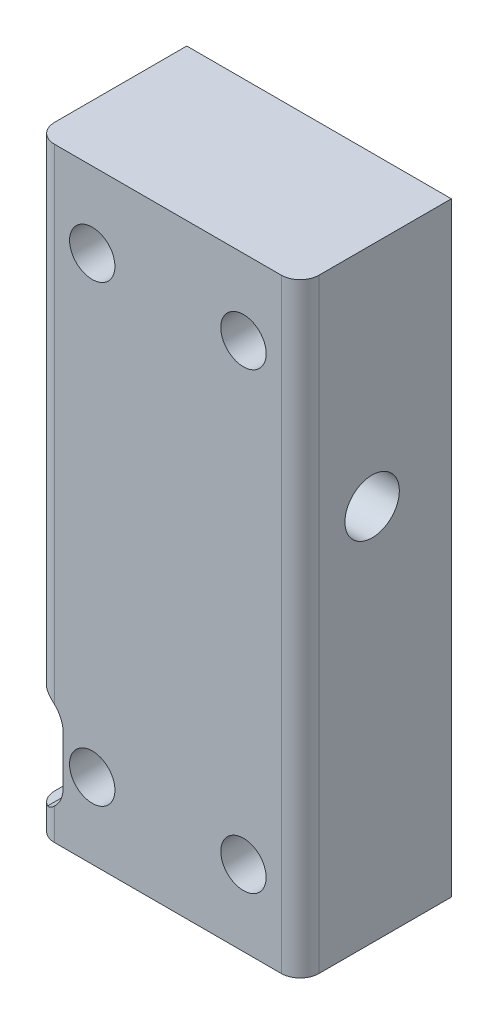
ISO-10303-21;
HEADER;
FILE_DESCRIPTION(('STEP AP214'),'2;1');
FILE_NAME('part.step','',(''),(''),'','','');
FILE_SCHEMA(('AUTOMOTIVE_DESIGN { 1 0 10303 214 1 1 1 1 }'));
ENDSEC;
DATA;
#1=APPLICATION_CONTEXT('core data for automotive mechanical design processes');
#2=APPLICATION_PROTOCOL_DEFINITION('international standard','automotive_design',2000,#1);
#3=PRODUCT_CONTEXT('',#1,'mechanical');
#4=PRODUCT('Part','Part','',(#3));
#5=PRODUCT_RELATED_PRODUCT_CATEGORY('part','',(#4));
#6=PRODUCT_DEFINITION_FORMATION('','',#4);
#7=PRODUCT_DEFINITION_CONTEXT('part definition',#1,'design');
#8=PRODUCT_DEFINITION('design','',#6,#7);
#9=PRODUCT_DEFINITION_SHAPE('','',#8);
#10=(LENGTH_UNIT() NAMED_UNIT(*) SI_UNIT(.MILLI.,.METRE.));
#11=(NAMED_UNIT(*) PLANE_ANGLE_UNIT() SI_UNIT($,.RADIAN.));
#12=(NAMED_UNIT(*) SI_UNIT($,.STERADIAN.) SOLID_ANGLE_UNIT());
#13=UNCERTAINTY_MEASURE_WITH_UNIT(LENGTH_MEASURE(1.E-05),#10,'distance_accuracy_value','');
#14=(GEOMETRIC_REPRESENTATION_CONTEXT(3) GLOBAL_UNCERTAINTY_ASSIGNED_CONTEXT((#13)) GLOBAL_UNIT_ASSIGNED_CONTEXT((#10,
#11,#12)) REPRESENTATION_CONTEXT('',''));
#15=CARTESIAN_POINT('',(0.,0.,0.));
#16=DIRECTION('',(0.,0.,1.));
#17=DIRECTION('',(1.,0.,0.));
#18=AXIS2_PLACEMENT_3D('',#15,#16,#17);
#19=CARTESIAN_POINT('',(0.,50.8,0.));
#20=DIRECTION('',(1.,0.,0.));
#21=DIRECTION('',(0.,0.,-1.));
#22=AXIS2_PLACEMENT_3D('',#19,#20,#21);
#23=PLANE('',#22);
#24=CARTESIAN_POINT('',(0.,31.7500000001631,-6.04519999270203));
#25=DIRECTION('',(1.,0.,0.));
#26=DIRECTION('',(0.,0.,-1.));
#27=AXIS2_PLACEMENT_3D('',#24,#25,#26);
#28=CIRCLE('',#27,2.286);
#29=CARTESIAN_POINT('',(0.,31.7500000001631,-8.33119999270203));
#30=VERTEX_POINT('',#29);
#31=EDGE_CURVE('E156',#30,#30,#28,.T.);
#32=ORIENTED_EDGE('',*,*,#31,.T.);
#33=EDGE_LOOP('',(#32));
#34=FACE_BOUND('',#33,.T.);
#35=DIRECTION('',(0.,0.,1.));
#36=VECTOR('',#35,1.);
#37=CARTESIAN_POINT('',(0.,0.,0.));
#38=LINE('',#37,#36);
#39=CARTESIAN_POINT('',(0.,0.,-12.7));
#40=VERTEX_POINT('',#39);
#41=CARTESIAN_POINT('',(0.,0.,-1.5875));
#42=VERTEX_POINT('',#41);
#43=EDGE_CURVE('E194',#40,#42,#38,.T.);
#44=ORIENTED_EDGE('',*,*,#43,.T.);
#45=DIRECTION('',(0.,-1.,0.));
#46=VECTOR('',#45,1.);
#47=CARTESIAN_POINT('',(0.,50.8,-1.5875));
#48=LINE('',#47,#46);
#49=CARTESIAN_POINT('',(0.,2.15899999999999,-1.5875));
#50=VERTEX_POINT('',#49);
#51=EDGE_CURVE('E235',#42,#50,#48,.F.);
#52=ORIENTED_EDGE('',*,*,#51,.T.);
#53=DIRECTION('',(0.,0.,-1.));
#54=VECTOR('',#53,1.);
#55=CARTESIAN_POINT('',(0.,2.15899999999999,0.));
#56=LINE('',#55,#54);
#57=CARTESIAN_POINT('',(0.,2.159,-6.35));
#58=VERTEX_POINT('',#57);
#59=EDGE_CURVE('E164',#50,#58,#56,.T.);
#60=ORIENTED_EDGE('',*,*,#59,.T.);
#61=CARTESIAN_POINT('',(0.,6.35,-6.35));
#62=DIRECTION('',(1.,0.,0.));
#63=DIRECTION('',(0.,1.,0.));
#64=AXIS2_PLACEMENT_3D('',#61,#62,#63);
#65=CIRCLE('',#64,4.191);
#66=CARTESIAN_POINT('',(0.,10.541,-6.35));
#67=VERTEX_POINT('',#66);
#68=EDGE_CURVE('E338',#58,#67,#65,.T.);
#69=ORIENTED_EDGE('',*,*,#68,.T.);
#70=DIRECTION('',(0.,0.,-1.));
#71=VECTOR('',#70,1.);
#72=CARTESIAN_POINT('',(0.,10.541,0.));
#73=LINE('',#72,#71);
#74=CARTESIAN_POINT('',(0.,10.541,-1.5875));
#75=VERTEX_POINT('',#74);
#76=EDGE_CURVE('E178',#75,#67,#73,.T.);
#77=ORIENTED_EDGE('',*,*,#76,.F.);
#78=DIRECTION('',(0.,-1.,0.));
#79=VECTOR('',#78,1.);
#80=CARTESIAN_POINT('',(0.,50.8,-1.5875));
#81=LINE('',#80,#79);
#82=CARTESIAN_POINT('',(0.,50.8,-1.5875));
#83=VERTEX_POINT('',#82);
#84=EDGE_CURVE('E233',#75,#83,#81,.F.);
#85=ORIENTED_EDGE('',*,*,#84,.T.);
#86=DIRECTION('',(0.,0.,1.));
#87=VECTOR('',#86,1.);
#88=CARTESIAN_POINT('',(0.,50.8,0.));
#89=LINE('',#88,#87);
#90=CARTESIAN_POINT('',(0.,50.8,-12.7));
#91=VERTEX_POINT('',#90);
#92=EDGE_CURVE('E197',#91,#83,#89,.T.);
#93=ORIENTED_EDGE('',*,*,#92,.F.);
#94=DIRECTION('',(0.,-1.,0.));
#95=VECTOR('',#94,1.);
#96=CARTESIAN_POINT('',(0.,50.8,-12.7));
#97=LINE('',#96,#95);
#98=EDGE_CURVE('E207',#91,#40,#97,.T.);
#99=ORIENTED_EDGE('',*,*,#98,.T.);
#100=EDGE_LOOP('',(#44,#52,#60,#69,#77,#85,#93,#99));
#101=FACE_BOUND('',#100,.T.);
#102=ADVANCED_FACE('F38',(#34,#101),#23,.F.);
#103=CARTESIAN_POINT('',(0.,50.8,0.));
#104=DIRECTION('',(0.,0.,-1.));
#105=DIRECTION('',(-1.,0.,0.));
#106=AXIS2_PLACEMENT_3D('',#103,#104,#105);
#107=PLANE('',#106);
#108=CARTESIAN_POINT('',(0.,4.33359649122807,0.));
#109=DIRECTION('',(0.,0.,-1.));
#110=DIRECTION('',(1.,0.,0.));
#111=AXIS2_PLACEMENT_3D('',#108,#109,#110);
#112=CIRCLE('',#111,2.31493174028122);
#113=CARTESIAN_POINT('',(2.286,3.96874999999999,0.));
#114=VERTEX_POINT('',#113);
#115=CARTESIAN_POINT('',(1.5875,2.64873664181583,0.));
#116=VERTEX_POINT('',#115);
#117=EDGE_CURVE('E160',#114,#116,#112,.T.);
#118=ORIENTED_EDGE('',*,*,#117,.T.);
#119=DIRECTION('',(0.,-1.,0.));
#120=VECTOR('',#119,1.);
#121=CARTESIAN_POINT('',(1.5875,50.8,0.));
#122=LINE('',#121,#120);
#123=CARTESIAN_POINT('',(1.5875,0.,0.));
#124=VERTEX_POINT('',#123);
#125=EDGE_CURVE('E226',#116,#124,#122,.T.);
#126=ORIENTED_EDGE('',*,*,#125,.T.);
#127=DIRECTION('',(1.,0.,0.));
#128=VECTOR('',#127,1.);
#129=CARTESIAN_POINT('',(0.,0.,0.));
#130=LINE('',#129,#128);
#131=CARTESIAN_POINT('',(20.6375,0.,0.));
#132=VERTEX_POINT('',#131);
#133=EDGE_CURVE('E210',#124,#132,#130,.T.);
#134=ORIENTED_EDGE('',*,*,#133,.T.);
#135=DIRECTION('',(0.,-1.,0.));
#136=VECTOR('',#135,1.);
#137=CARTESIAN_POINT('',(20.6375,50.8,0.));
#138=LINE('',#137,#136);
#139=CARTESIAN_POINT('',(20.6375,50.8,0.));
#140=VERTEX_POINT('',#139);
#141=EDGE_CURVE('E221',#132,#140,#138,.F.);
#142=ORIENTED_EDGE('',*,*,#141,.T.);
#143=DIRECTION('',(1.,0.,0.));
#144=VECTOR('',#143,1.);
#145=CARTESIAN_POINT('',(0.,50.8,0.));
#146=LINE('',#145,#144);
#147=CARTESIAN_POINT('',(1.5875,50.8,0.));
#148=VERTEX_POINT('',#147);
#149=EDGE_CURVE('E200',#148,#140,#146,.T.);
#150=ORIENTED_EDGE('',*,*,#149,.F.);
#151=DIRECTION('',(0.,-1.,0.));
#152=VECTOR('',#151,1.);
#153=CARTESIAN_POINT('',(1.5875,50.8,0.));
#154=LINE('',#153,#152);
#155=CARTESIAN_POINT('',(1.5875,10.0512633581842,0.));
#156=VERTEX_POINT('',#155);
#157=EDGE_CURVE('E223',#148,#156,#154,.T.);
#158=ORIENTED_EDGE('',*,*,#157,.T.);
#159=CARTESIAN_POINT('',(0.,8.36640350877193,0.));
#160=DIRECTION('',(0.,0.,-1.));
#161=DIRECTION('',(1.,0.,0.));
#162=AXIS2_PLACEMENT_3D('',#159,#160,#161);
#163=CIRCLE('',#162,2.31493174028122);
#164=CARTESIAN_POINT('',(2.286,8.73125,0.));
#165=VERTEX_POINT('',#164);
#166=EDGE_CURVE('E331',#156,#165,#163,.T.);
#167=ORIENTED_EDGE('',*,*,#166,.T.);
#168=DIRECTION('',(0.,-1.,0.));
#169=VECTOR('',#168,1.);
#170=CARTESIAN_POINT('',(2.286,8.73125,0.));
#171=LINE('',#170,#169);
#172=EDGE_CURVE('E329',#165,#114,#171,.T.);
#173=ORIENTED_EDGE('',*,*,#172,.T.);
#174=EDGE_LOOP('',(#118,#126,#134,#142,#150,#158,#167,#173));
#175=FACE_BOUND('',#174,.T.);
#176=CARTESIAN_POINT('',(17.4625,6.35,0.));
#177=DIRECTION('',(0.,0.,-1.));
#178=DIRECTION('',(-1.,0.,0.));
#179=AXIS2_PLACEMENT_3D('',#176,#177,#178);
#180=CIRCLE('',#179,1.905);
#181=CARTESIAN_POINT('',(15.5575,6.35,0.));
#182=VERTEX_POINT('',#181);
#183=EDGE_CURVE('E183',#182,#182,#180,.T.);
#184=ORIENTED_EDGE('',*,*,#183,.T.);
#185=EDGE_LOOP('',(#184));
#186=FACE_BOUND('',#185,.T.);
#187=CARTESIAN_POINT('',(4.7625,44.45,0.));
#188=DIRECTION('',(0.,0.,-1.));
#189=DIRECTION('',(-1.,0.,0.));
#190=AXIS2_PLACEMENT_3D('',#187,#188,#189);
#191=CIRCLE('',#190,1.905);
#192=CARTESIAN_POINT('',(2.8575,44.45,0.));
#193=VERTEX_POINT('',#192);
#194=EDGE_CURVE('E174',#193,#193,#191,.T.);
#195=ORIENTED_EDGE('',*,*,#194,.T.);
#196=EDGE_LOOP('',(#195));
#197=FACE_BOUND('',#196,.T.);
#198=CARTESIAN_POINT('',(4.7625,6.35,0.));
#199=DIRECTION('',(0.,0.,-1.));
#200=DIRECTION('',(-1.,0.,0.));
#201=AXIS2_PLACEMENT_3D('',#198,#199,#200);
#202=CIRCLE('',#201,1.905);
#203=CARTESIAN_POINT('',(2.8575,6.35,0.));
#204=VERTEX_POINT('',#203);
#205=EDGE_CURVE('E175',#204,#204,#202,.T.);
#206=ORIENTED_EDGE('',*,*,#205,.T.);
#207=EDGE_LOOP('',(#206));
#208=FACE_BOUND('',#207,.T.);
#209=CARTESIAN_POINT('',(17.4625,44.45,0.));
#210=DIRECTION('',(0.,0.,-1.));
#211=DIRECTION('',(-1.,0.,0.));
#212=AXIS2_PLACEMENT_3D('',#209,#210,#211);
#213=CIRCLE('',#212,1.905);
#214=CARTESIAN_POINT('',(15.5575,44.45,0.));
#215=VERTEX_POINT('',#214);
#216=EDGE_CURVE('E191',#215,#215,#213,.T.);
#217=ORIENTED_EDGE('',*,*,#216,.T.);
#218=EDGE_LOOP('',(#217));
#219=FACE_BOUND('',#218,.T.);
#220=ADVANCED_FACE('F302',(#175,#186,#197,#208,#219),#107,.F.);
#221=CARTESIAN_POINT('',(22.225,50.8,0.));
#222=DIRECTION('',(-1.,0.,0.));
#223=DIRECTION('',(0.,0.,1.));
#224=AXIS2_PLACEMENT_3D('',#221,#222,#223);
#225=PLANE('',#224);
#226=CARTESIAN_POINT('',(22.225,31.7500000001631,-6.04519999270203));
#227=DIRECTION('',(1.,0.,0.));
#228=DIRECTION('',(0.,0.,-1.));
#229=AXIS2_PLACEMENT_3D('',#226,#227,#228);
#230=CIRCLE('',#229,2.286);
#231=CARTESIAN_POINT('',(22.225,31.7500000001631,-8.33119999270203));
#232=VERTEX_POINT('',#231);
#233=EDGE_CURVE('E506',#232,#232,#230,.T.);
#234=ORIENTED_EDGE('',*,*,#233,.F.);
#235=EDGE_LOOP('',(#234));
#236=FACE_BOUND('',#235,.T.);
#237=DIRECTION('',(0.,0.,-1.));
#238=VECTOR('',#237,1.);
#239=CARTESIAN_POINT('',(22.225,50.8,0.));
#240=LINE('',#239,#238);
#241=CARTESIAN_POINT('',(22.225,50.8,-1.5875));
#242=VERTEX_POINT('',#241);
#243=CARTESIAN_POINT('',(22.225,50.8,-12.7));
#244=VERTEX_POINT('',#243);
#245=EDGE_CURVE('E203',#242,#244,#240,.T.);
#246=ORIENTED_EDGE('',*,*,#245,.F.);
#247=DIRECTION('',(0.,-1.,0.));
#248=VECTOR('',#247,1.);
#249=CARTESIAN_POINT('',(22.225,50.8,-1.5875));
#250=LINE('',#249,#248);
#251=CARTESIAN_POINT('',(22.225,0.,-1.5875));
#252=VERTEX_POINT('',#251);
#253=EDGE_CURVE('E11',#242,#252,#250,.T.);
#254=ORIENTED_EDGE('',*,*,#253,.T.);
#255=DIRECTION('',(0.,0.,-1.));
#256=VECTOR('',#255,1.);
#257=CARTESIAN_POINT('',(22.225,0.,0.));
#258=LINE('',#257,#256);
#259=CARTESIAN_POINT('',(22.225,0.,-12.7));
#260=VERTEX_POINT('',#259);
#261=EDGE_CURVE('E213',#252,#260,#258,.T.);
#262=ORIENTED_EDGE('',*,*,#261,.T.);
#263=DIRECTION('',(0.,-1.,0.));
#264=VECTOR('',#263,1.);
#265=CARTESIAN_POINT('',(22.225,50.8,-12.7));
#266=LINE('',#265,#264);
#267=EDGE_CURVE('E218',#244,#260,#266,.T.);
#268=ORIENTED_EDGE('',*,*,#267,.F.);
#269=EDGE_LOOP('',(#246,#254,#262,#268));
#270=FACE_BOUND('',#269,.T.);
#271=ADVANCED_FACE('F298',(#236,#270),#225,.F.);
#272=CARTESIAN_POINT('',(0.,50.8,-12.7));
#273=DIRECTION('',(0.,0.,1.));
#274=DIRECTION('',(1.,0.,0.));
#275=AXIS2_PLACEMENT_3D('',#272,#273,#274);
#276=PLANE('',#275);
#277=CARTESIAN_POINT('',(17.4625,6.35,-12.7));
#278=DIRECTION('',(0.,0.,-1.));
#279=DIRECTION('',(-1.,0.,0.));
#280=AXIS2_PLACEMENT_3D('',#277,#278,#279);
#281=CIRCLE('',#280,1.905);
#282=CARTESIAN_POINT('',(15.5575,6.35,-12.7));
#283=VERTEX_POINT('',#282);
#284=EDGE_CURVE('E179',#283,#283,#281,.T.);
#285=ORIENTED_EDGE('',*,*,#284,.F.);
#286=EDGE_LOOP('',(#285));
#287=FACE_BOUND('',#286,.T.);
#288=CARTESIAN_POINT('',(4.7625,44.45,-12.7));
#289=DIRECTION('',(0.,0.,-1.));
#290=DIRECTION('',(-1.,0.,0.));
#291=AXIS2_PLACEMENT_3D('',#288,#289,#290);
#292=CIRCLE('',#291,1.905);
#293=CARTESIAN_POINT('',(2.8575,44.45,-12.7));
#294=VERTEX_POINT('',#293);
#295=EDGE_CURVE('E186',#294,#294,#292,.T.);
#296=ORIENTED_EDGE('',*,*,#295,.F.);
#297=EDGE_LOOP('',(#296));
#298=FACE_BOUND('',#297,.T.);
#299=CARTESIAN_POINT('',(4.7625,6.35,-12.7));
#300=DIRECTION('',(0.,0.,-1.));
#301=DIRECTION('',(-1.,0.,0.));
#302=AXIS2_PLACEMENT_3D('',#299,#300,#301);
#303=CIRCLE('',#302,1.905);
#304=CARTESIAN_POINT('',(2.8575,6.35,-12.7));
#305=VERTEX_POINT('',#304);
#306=EDGE_CURVE('E171',#305,#305,#303,.T.);
#307=ORIENTED_EDGE('',*,*,#306,.F.);
#308=EDGE_LOOP('',(#307));
#309=FACE_BOUND('',#308,.T.);
#310=CARTESIAN_POINT('',(17.4625,44.45,-12.7));
#311=DIRECTION('',(0.,0.,-1.));
#312=DIRECTION('',(-1.,0.,0.));
#313=AXIS2_PLACEMENT_3D('',#310,#311,#312);
#314=CIRCLE('',#313,1.905);
#315=CARTESIAN_POINT('',(15.5575,44.45,-12.7));
#316=VERTEX_POINT('',#315);
#317=EDGE_CURVE('E182',#316,#316,#314,.T.);
#318=ORIENTED_EDGE('',*,*,#317,.F.);
#319=EDGE_LOOP('',(#318));
#320=FACE_BOUND('',#319,.T.);
#321=DIRECTION('',(-1.,0.,0.));
#322=VECTOR('',#321,1.);
#323=CARTESIAN_POINT('',(0.,0.,-12.7));
#324=LINE('',#323,#322);
#325=EDGE_CURVE('E201',#260,#40,#324,.T.);
#326=ORIENTED_EDGE('',*,*,#325,.T.);
#327=ORIENTED_EDGE('',*,*,#98,.F.);
#328=DIRECTION('',(-1.,0.,0.));
#329=VECTOR('',#328,1.);
#330=CARTESIAN_POINT('',(0.,50.8,-12.7));
#331=LINE('',#330,#329);
#332=EDGE_CURVE('E205',#244,#91,#331,.T.);
#333=ORIENTED_EDGE('',*,*,#332,.F.);
#334=ORIENTED_EDGE('',*,*,#267,.T.);
#335=EDGE_LOOP('',(#326,#327,#333,#334));
#336=FACE_BOUND('',#335,.T.);
#337=ADVANCED_FACE('F292',(#287,#298,#309,#320,#336),#276,.F.);
#338=CARTESIAN_POINT('',(0.,50.8,0.));
#339=DIRECTION('',(0.,-1.,0.));
#340=DIRECTION('',(0.,0.,-1.));
#341=AXIS2_PLACEMENT_3D('',#338,#339,#340);
#342=PLANE('',#341);
#343=ORIENTED_EDGE('',*,*,#92,.T.);
#344=CARTESIAN_POINT('',(1.5875,50.8,-1.5875));
#345=DIRECTION('',(0.,-1.,0.));
#346=DIRECTION('',(0.,0.,-1.));
#347=AXIS2_PLACEMENT_3D('',#344,#345,#346);
#348=CIRCLE('',#347,1.5875);
#349=EDGE_CURVE('E46',#83,#148,#348,.F.);
#350=ORIENTED_EDGE('',*,*,#349,.T.);
#351=ORIENTED_EDGE('',*,*,#149,.T.);
#352=CARTESIAN_POINT('',(20.6375,50.8,-1.5875));
#353=DIRECTION('',(0.,-1.,0.));
#354=DIRECTION('',(0.,0.,-1.));
#355=AXIS2_PLACEMENT_3D('',#352,#353,#354);
#356=CIRCLE('',#355,1.5875);
#357=EDGE_CURVE('E53',#140,#242,#356,.F.);
#358=ORIENTED_EDGE('',*,*,#357,.T.);
#359=ORIENTED_EDGE('',*,*,#245,.T.);
#360=ORIENTED_EDGE('',*,*,#332,.T.);
#361=EDGE_LOOP('',(#343,#350,#351,#358,#359,#360));
#362=FACE_BOUND('',#361,.T.);
#363=ADVANCED_FACE('F289',(#362),#342,.F.);
#364=CARTESIAN_POINT('',(0.,0.,0.));
#365=DIRECTION('',(0.,-1.,0.));
#366=DIRECTION('',(0.,0.,-1.));
#367=AXIS2_PLACEMENT_3D('',#364,#365,#366);
#368=PLANE('',#367);
#369=ORIENTED_EDGE('',*,*,#133,.F.);
#370=CARTESIAN_POINT('',(1.5875,0.,-1.5875));
#371=DIRECTION('',(0.,-1.,0.));
#372=DIRECTION('',(0.,0.,-1.));
#373=AXIS2_PLACEMENT_3D('',#370,#371,#372);
#374=CIRCLE('',#373,1.5875);
#375=EDGE_CURVE('E231',#124,#42,#374,.T.);
#376=ORIENTED_EDGE('',*,*,#375,.T.);
#377=ORIENTED_EDGE('',*,*,#43,.F.);
#378=ORIENTED_EDGE('',*,*,#325,.F.);
#379=ORIENTED_EDGE('',*,*,#261,.F.);
#380=CARTESIAN_POINT('',(20.6375,0.,-1.5875));
#381=DIRECTION('',(0.,-1.,0.));
#382=DIRECTION('',(0.,0.,-1.));
#383=AXIS2_PLACEMENT_3D('',#380,#381,#382);
#384=CIRCLE('',#383,1.5875);
#385=EDGE_CURVE('E229',#252,#132,#384,.T.);
#386=ORIENTED_EDGE('',*,*,#385,.T.);
#387=EDGE_LOOP('',(#369,#376,#377,#378,#379,#386));
#388=FACE_BOUND('',#387,.T.);
#389=ADVANCED_FACE('F287',(#388),#368,.T.);
#390=CARTESIAN_POINT('',(17.4625,44.45,0.));
#391=DIRECTION('',(0.,0.,-1.));
#392=DIRECTION('',(-1.,0.,0.));
#393=AXIS2_PLACEMENT_3D('',#390,#391,#392);
#394=CYLINDRICAL_SURFACE('',#393,1.905);
#395=ORIENTED_EDGE('',*,*,#216,.F.);
#396=EDGE_LOOP('',(#395));
#397=FACE_BOUND('',#396,.T.);
#398=ORIENTED_EDGE('',*,*,#317,.T.);
#399=EDGE_LOOP('',(#398));
#400=FACE_BOUND('',#399,.T.);
#401=ADVANCED_FACE('F277',(#397,#400),#394,.F.);
#402=CARTESIAN_POINT('',(4.7625,6.35,0.));
#403=DIRECTION('',(0.,0.,-1.));
#404=DIRECTION('',(-1.,0.,0.));
#405=AXIS2_PLACEMENT_3D('',#402,#403,#404);
#406=CYLINDRICAL_SURFACE('',#405,1.905);
#407=ORIENTED_EDGE('',*,*,#205,.F.);
#408=EDGE_LOOP('',(#407));
#409=FACE_BOUND('',#408,.T.);
#410=ORIENTED_EDGE('',*,*,#306,.T.);
#411=EDGE_LOOP('',(#410));
#412=FACE_BOUND('',#411,.T.);
#413=ADVANCED_FACE('F273',(#409,#412),#406,.F.);
#414=CARTESIAN_POINT('',(4.7625,44.45,0.));
#415=DIRECTION('',(0.,0.,-1.));
#416=DIRECTION('',(-1.,0.,0.));
#417=AXIS2_PLACEMENT_3D('',#414,#415,#416);
#418=CYLINDRICAL_SURFACE('',#417,1.905);
#419=ORIENTED_EDGE('',*,*,#194,.F.);
#420=EDGE_LOOP('',(#419));
#421=FACE_BOUND('',#420,.T.);
#422=ORIENTED_EDGE('',*,*,#295,.T.);
#423=EDGE_LOOP('',(#422));
#424=FACE_BOUND('',#423,.T.);
#425=ADVANCED_FACE('F276',(#421,#424),#418,.F.);
#426=CARTESIAN_POINT('',(17.4625,6.35,0.));
#427=DIRECTION('',(0.,0.,-1.));
#428=DIRECTION('',(-1.,0.,0.));
#429=AXIS2_PLACEMENT_3D('',#426,#427,#428);
#430=CYLINDRICAL_SURFACE('',#429,1.905);
#431=ORIENTED_EDGE('',*,*,#183,.F.);
#432=EDGE_LOOP('',(#431));
#433=FACE_BOUND('',#432,.T.);
#434=ORIENTED_EDGE('',*,*,#284,.T.);
#435=EDGE_LOOP('',(#434));
#436=FACE_BOUND('',#435,.T.);
#437=ADVANCED_FACE('F271',(#433,#436),#430,.F.);
#438=CARTESIAN_POINT('',(0.,10.541,0.));
#439=DIRECTION('',(0.,1.,0.));
#440=DIRECTION('',(0.,0.,1.));
#441=AXIS2_PLACEMENT_3D('',#438,#439,#440);
#442=PLANE('',#441);
#443=DIRECTION('',(0.,0.,-1.));
#444=VECTOR('',#443,1.);
#445=CARTESIAN_POINT('',(0.793750000000001,10.541,0.));
#446=LINE('',#445,#444);
#447=CARTESIAN_POINT('',(0.793750000000001,10.541,-0.212684671492203));
#448=VERTEX_POINT('',#447);
#449=CARTESIAN_POINT('',(0.793750000000001,10.541,-6.35));
#450=VERTEX_POINT('',#449);
#451=EDGE_CURVE('E166',#448,#450,#446,.T.);
#452=ORIENTED_EDGE('',*,*,#451,.F.);
#453=CARTESIAN_POINT('',(1.5875,10.541,-1.5875));
#454=DIRECTION('',(0.,1.,0.));
#455=DIRECTION('',(0.,0.,1.));
#456=AXIS2_PLACEMENT_3D('',#453,#454,#455);
#457=CIRCLE('',#456,1.5875);
#458=EDGE_CURVE('E351',#448,#75,#457,.F.);
#459=ORIENTED_EDGE('',*,*,#458,.T.);
#460=ORIENTED_EDGE('',*,*,#76,.T.);
#461=DIRECTION('',(1.,0.,0.));
#462=VECTOR('',#461,1.);
#463=CARTESIAN_POINT('',(0.,10.541,-6.35));
#464=LINE('',#463,#462);
#465=EDGE_CURVE('E335',#67,#450,#464,.T.);
#466=ORIENTED_EDGE('',*,*,#465,.T.);
#467=EDGE_LOOP('',(#452,#459,#460,#466));
#468=FACE_BOUND('',#467,.T.);
#469=ADVANCED_FACE('F268',(#468),#442,.F.);
#470=CARTESIAN_POINT('',(0.,2.15899999999999,0.));
#471=DIRECTION('',(0.,-1.,0.));
#472=DIRECTION('',(0.,0.,-1.));
#473=AXIS2_PLACEMENT_3D('',#470,#471,#472);
#474=PLANE('',#473);
#475=ORIENTED_EDGE('',*,*,#59,.F.);
#476=CARTESIAN_POINT('',(1.5875,2.15899999999999,-1.5875));
#477=DIRECTION('',(0.,-1.,0.));
#478=DIRECTION('',(0.,0.,-1.));
#479=AXIS2_PLACEMENT_3D('',#476,#477,#478);
#480=CIRCLE('',#479,1.5875);
#481=CARTESIAN_POINT('',(0.79375,2.15899999999999,-0.212684671492204));
#482=VERTEX_POINT('',#481);
#483=EDGE_CURVE('E237',#50,#482,#480,.F.);
#484=ORIENTED_EDGE('',*,*,#483,.T.);
#485=DIRECTION('',(0.,0.,-1.));
#486=VECTOR('',#485,1.);
#487=CARTESIAN_POINT('',(0.79375,2.15899999999999,0.));
#488=LINE('',#487,#486);
#489=CARTESIAN_POINT('',(0.793750000000004,2.159,-6.35));
#490=VERTEX_POINT('',#489);
#491=EDGE_CURVE('E162',#482,#490,#488,.T.);
#492=ORIENTED_EDGE('',*,*,#491,.T.);
#493=DIRECTION('',(-1.,0.,0.));
#494=VECTOR('',#493,1.);
#495=CARTESIAN_POINT('',(0.,2.15899999999999,-6.35));
#496=LINE('',#495,#494);
#497=EDGE_CURVE('E145',#490,#58,#496,.T.);
#498=ORIENTED_EDGE('',*,*,#497,.T.);
#499=EDGE_LOOP('',(#475,#484,#492,#498));
#500=FACE_BOUND('',#499,.T.);
#501=ADVANCED_FACE('F260',(#500),#474,.F.);
#502=CARTESIAN_POINT('',(0.,4.33359649122807,0.));
#503=DIRECTION('',(0.,0.,-1.));
#504=DIRECTION('',(-1.,0.,0.));
#505=AXIS2_PLACEMENT_3D('',#502,#503,#504);
#506=CYLINDRICAL_SURFACE('',#505,2.31493174028122);
#507=ORIENTED_EDGE('',*,*,#491,.F.);
#508=CARTESIAN_POINT('',(0.79375,2.15899999999999,-0.212684671492204));
#509=CARTESIAN_POINT('',(0.829028170382998,2.17186597047792,-0.19230420783783));
#510=CARTESIAN_POINT('',(0.864775832027266,2.18589747020629,-0.173488258426767));
#511=CARTESIAN_POINT('',(0.936744459223206,2.21630307292713,-0.138964186585461));
#512=CARTESIAN_POINT('',(0.972965141732829,2.23267582853355,-0.123254288936569));
#513=CARTESIAN_POINT('',(1.04452572341826,2.26733976201032,-0.0952615699153396));
#514=CARTESIAN_POINT('',(1.07986437939089,2.28557094653592,-0.082901166809874));
#515=CARTESIAN_POINT('',(1.1501922016253,2.32422342423593,-0.060975784612678));
#516=CARTESIAN_POINT('',(1.18518138241749,2.34464462593639,-0.0514106888269902));
#517=CARTESIAN_POINT('',(1.2839097830872,2.40586591707907,-0.0279111859193128));
#518=CARTESIAN_POINT('',(1.3468505492318,2.4492541200729,-0.0171567299004477));
#519=CARTESIAN_POINT('',(1.43884800772428,2.51971104490011,-0.00666150441743754));
#520=CARTESIAN_POINT('',(1.46947043013622,2.54442924678238,-0.00410753281314415));
#521=CARTESIAN_POINT('',(1.52945580853813,2.59543085264999,-0.000778425618100952));
#522=CARTESIAN_POINT('',(1.55881947529248,2.62171335277243,-2.27283393149186E-06));
#523=CARTESIAN_POINT('',(1.5875,2.64873664181583,0.));
#524=B_SPLINE_CURVE_WITH_KNOTS('',3,(#508,#509,#510,#511,#512,#513,#514,#515,#516,#517,#518,
#519,#520,#521,#522,#523),.UNSPECIFIED.,.F.,.F.,(4,2,2,2,2,2,2,4),(0.,0.128118282661172,
0.25616312815696,0.380922982341794,0.505677627510297,0.736296048611621,0.854534251064937,
0.972704785657537),.UNSPECIFIED.);
#525=EDGE_CURVE('E239',#482,#116,#524,.T.);
#526=ORIENTED_EDGE('',*,*,#525,.T.);
#527=ORIENTED_EDGE('',*,*,#117,.F.);
#528=DIRECTION('',(0.,0.,-1.));
#529=VECTOR('',#528,1.);
#530=CARTESIAN_POINT('',(2.286,3.96874999999999,0.));
#531=LINE('',#530,#529);
#532=CARTESIAN_POINT('',(2.286,3.96875,-6.35));
#533=VERTEX_POINT('',#532);
#534=EDGE_CURVE('E151',#114,#533,#531,.T.);
#535=ORIENTED_EDGE('',*,*,#534,.T.);
#536=CARTESIAN_POINT('',(0.,4.33359649122807,-6.35));
#537=DIRECTION('',(0.,0.,-1.));
#538=DIRECTION('',(1.,0.,0.));
#539=AXIS2_PLACEMENT_3D('',#536,#537,#538);
#540=CIRCLE('',#539,2.31493174028122);
#541=EDGE_CURVE('E134',#533,#490,#540,.T.);
#542=ORIENTED_EDGE('',*,*,#541,.T.);
#543=EDGE_LOOP('',(#507,#526,#527,#535,#542));
#544=FACE_BOUND('',#543,.T.);
#545=ADVANCED_FACE('F158',(#544),#506,.F.);
#546=CARTESIAN_POINT('',(2.286,8.73125,0.));
#547=DIRECTION('',(1.,0.,0.));
#548=DIRECTION('',(0.,0.,-1.));
#549=AXIS2_PLACEMENT_3D('',#546,#547,#548);
#550=PLANE('',#549);
#551=DIRECTION('',(0.,0.,-1.));
#552=VECTOR('',#551,1.);
#553=CARTESIAN_POINT('',(2.286,8.73125,0.));
#554=LINE('',#553,#552);
#555=CARTESIAN_POINT('',(2.286,8.73125,-6.35));
#556=VERTEX_POINT('',#555);
#557=EDGE_CURVE('E154',#165,#556,#554,.T.);
#558=ORIENTED_EDGE('',*,*,#557,.T.);
#559=CARTESIAN_POINT('',(2.286,6.35,-6.35));
#560=DIRECTION('',(1.,0.,0.));
#561=DIRECTION('',(0.,1.,0.));
#562=AXIS2_PLACEMENT_3D('',#559,#560,#561);
#563=CIRCLE('',#562,2.38125);
#564=EDGE_CURVE('E138',#533,#556,#563,.T.);
#565=ORIENTED_EDGE('',*,*,#564,.F.);
#566=ORIENTED_EDGE('',*,*,#534,.F.);
#567=ORIENTED_EDGE('',*,*,#172,.F.);
#568=EDGE_LOOP('',(#558,#565,#566,#567));
#569=FACE_BOUND('',#568,.T.);
#570=ADVANCED_FACE('F149',(#569),#550,.F.);
#571=CARTESIAN_POINT('',(0.,8.36640350877193,0.));
#572=DIRECTION('',(0.,0.,-1.));
#573=DIRECTION('',(-1.,0.,0.));
#574=AXIS2_PLACEMENT_3D('',#571,#572,#573);
#575=CYLINDRICAL_SURFACE('',#574,2.31493174028122);
#576=ORIENTED_EDGE('',*,*,#166,.F.);
#577=CARTESIAN_POINT('',(1.5875,10.0512633581842,0.));
#578=CARTESIAN_POINT('',(1.55513466753788,10.0817681993022,1.92881277254662E-06));
#579=CARTESIAN_POINT('',(1.52186946546536,10.1113404789938,-0.000990171253855526));
#580=CARTESIAN_POINT('',(1.45374875897284,10.168483879365,-0.00527634140452152));
#581=CARTESIAN_POINT('',(1.41889165590183,10.1960529129911,-0.00857277531532114));
#582=CARTESIAN_POINT('',(1.34883513640869,10.2482666939701,-0.0176568992224938));
#583=CARTESIAN_POINT('',(1.31367114014255,10.2729707882097,-0.0233740065801648));
#584=CARTESIAN_POINT('',(1.24243743845068,10.3201399453316,-0.0375292694262437));
#585=CARTESIAN_POINT('',(1.20636817062901,10.3426060649022,-0.0459661326995038));
#586=CARTESIAN_POINT('',(1.10826802757876,10.4000559988471,-0.0727166210683082));
#587=CARTESIAN_POINT('',(1.04565501425564,10.4328578818509,-0.0938163935856463));
#588=CARTESIAN_POINT('',(0.951403542486821,10.477089340724,-0.132599520127439));
#589=CARTESIAN_POINT('',(0.919555850881883,10.4911386423016,-0.146927903801492));
#590=CARTESIAN_POINT('',(0.856271899536638,10.5174223030476,-0.177994550242042));
#591=CARTESIAN_POINT('',(0.824835812806859,10.5296559200288,-0.194733793003311));
#592=CARTESIAN_POINT('',(0.793750000000001,10.541,-0.212684671492203));
#593=B_SPLINE_CURVE_WITH_KNOTS('',3,(#577,#578,#579,#580,#581,#582,#583,#584,#585,#586,#587,
#588,#589,#590,#591,#592),.UNSPECIFIED.,.F.,.F.,(4,2,2,2,2,2,2,4),(0.,0.133418927692932,
0.266974920129195,0.396879107118736,0.526721664548442,0.747012810195603,0.85983524864786,
0.97270367863228),.UNSPECIFIED.);
#594=EDGE_CURVE('E61',#156,#448,#593,.T.);
#595=ORIENTED_EDGE('',*,*,#594,.T.);
#596=ORIENTED_EDGE('',*,*,#451,.T.);
#597=CARTESIAN_POINT('',(0.,8.36640350877193,-6.35));
#598=DIRECTION('',(0.,0.,-1.));
#599=DIRECTION('',(1.,0.,0.));
#600=AXIS2_PLACEMENT_3D('',#597,#598,#599);
#601=CIRCLE('',#600,2.31493174028122);
#602=EDGE_CURVE('E146',#450,#556,#601,.T.);
#603=ORIENTED_EDGE('',*,*,#602,.T.);
#604=ORIENTED_EDGE('',*,*,#557,.F.);
#605=EDGE_LOOP('',(#576,#595,#596,#603,#604));
#606=FACE_BOUND('',#605,.T.);
#607=ADVANCED_FACE('F263',(#606),#575,.F.);
#608=CARTESIAN_POINT('',(2.286,6.35,-6.35));
#609=DIRECTION('',(1.,0.,0.));
#610=DIRECTION('',(0.,1.,0.));
#611=AXIS2_PLACEMENT_3D('',#608,#609,#610);
#612=CYLINDRICAL_SURFACE('',#611,4.191);
#613=CARTESIAN_POINT('',(0.793750000000002,6.35,-6.35));
#614=DIRECTION('',(1.,0.,0.));
#615=DIRECTION('',(0.,1.,0.));
#616=AXIS2_PLACEMENT_3D('',#613,#614,#615);
#617=CIRCLE('',#616,4.191);
#618=EDGE_CURVE('E141',#490,#450,#617,.T.);
#619=ORIENTED_EDGE('',*,*,#618,.T.);
#620=ORIENTED_EDGE('',*,*,#465,.F.);
#621=ORIENTED_EDGE('',*,*,#68,.F.);
#622=ORIENTED_EDGE('',*,*,#497,.F.);
#623=EDGE_LOOP('',(#619,#620,#621,#622));
#624=FACE_BOUND('',#623,.T.);
#625=ADVANCED_FACE('F267',(#624),#612,.F.);
#626=CARTESIAN_POINT('',(0.,6.35,-6.35));
#627=DIRECTION('',(1.,0.,0.));
#628=DIRECTION('',(0.,1.,0.));
#629=AXIS2_PLACEMENT_3D('',#626,#627,#628);
#630=DEGENERATE_TOROIDAL_SURFACE('',#629,2.01640350877193,2.31493174028122,.T.);
#631=ORIENTED_EDGE('',*,*,#564,.T.);
#632=ORIENTED_EDGE('',*,*,#602,.F.);
#633=ORIENTED_EDGE('',*,*,#618,.F.);
#634=ORIENTED_EDGE('',*,*,#541,.F.);
#635=EDGE_LOOP('',(#631,#632,#633,#634));
#636=FACE_BOUND('',#635,.T.);
#637=ADVANCED_FACE('F136',(#636),#630,.F.);
#638=CARTESIAN_POINT('',(1.5875,50.8,-1.5875));
#639=DIRECTION('',(0.,-1.,0.));
#640=DIRECTION('',(0.,0.,-1.));
#641=AXIS2_PLACEMENT_3D('',#638,#639,#640);
#642=CYLINDRICAL_SURFACE('',#641,1.5875);
#643=ORIENTED_EDGE('',*,*,#483,.F.);
#644=ORIENTED_EDGE('',*,*,#51,.F.);
#645=ORIENTED_EDGE('',*,*,#375,.F.);
#646=ORIENTED_EDGE('',*,*,#125,.F.);
#647=ORIENTED_EDGE('',*,*,#525,.F.);
#648=EDGE_LOOP('',(#643,#644,#645,#646,#647));
#649=FACE_BOUND('',#648,.T.);
#650=ADVANCED_FACE('F253',(#649),#642,.T.);
#651=CARTESIAN_POINT('',(1.5875,50.8,-1.5875));
#652=DIRECTION('',(0.,-1.,0.));
#653=DIRECTION('',(0.,0.,-1.));
#654=AXIS2_PLACEMENT_3D('',#651,#652,#653);
#655=CYLINDRICAL_SURFACE('',#654,1.5875);
#656=ORIENTED_EDGE('',*,*,#349,.F.);
#657=ORIENTED_EDGE('',*,*,#84,.F.);
#658=ORIENTED_EDGE('',*,*,#458,.F.);
#659=ORIENTED_EDGE('',*,*,#594,.F.);
#660=ORIENTED_EDGE('',*,*,#157,.F.);
#661=EDGE_LOOP('',(#656,#657,#658,#659,#660));
#662=FACE_BOUND('',#661,.T.);
#663=ADVANCED_FACE('F355',(#662),#655,.T.);
#664=CARTESIAN_POINT('',(20.6375,50.8,-1.5875));
#665=DIRECTION('',(0.,-1.,0.));
#666=DIRECTION('',(0.,0.,-1.));
#667=AXIS2_PLACEMENT_3D('',#664,#665,#666);
#668=CYLINDRICAL_SURFACE('',#667,1.5875);
#669=ORIENTED_EDGE('',*,*,#357,.F.);
#670=ORIENTED_EDGE('',*,*,#141,.F.);
#671=ORIENTED_EDGE('',*,*,#385,.F.);
#672=ORIENTED_EDGE('',*,*,#253,.F.);
#673=EDGE_LOOP('',(#669,#670,#671,#672));
#674=FACE_BOUND('',#673,.T.);
#675=ADVANCED_FACE('F40',(#674),#668,.T.);
#676=CARTESIAN_POINT('',(0.,31.7500000001631,-6.04519999270203));
#677=DIRECTION('',(1.,0.,0.));
#678=DIRECTION('',(0.,0.,-1.));
#679=AXIS2_PLACEMENT_3D('',#676,#677,#678);
#680=CYLINDRICAL_SURFACE('',#679,2.286);
#681=ORIENTED_EDGE('',*,*,#31,.F.);
#682=EDGE_LOOP('',(#681));
#683=FACE_BOUND('',#682,.T.);
#684=ORIENTED_EDGE('',*,*,#233,.T.);
#685=EDGE_LOOP('',(#684));
#686=FACE_BOUND('',#685,.T.);
#687=ADVANCED_FACE('F365',(#683,#686),#680,.F.);
#688=CLOSED_SHELL('',(#102,#220,#271,#337,#363,#389,#401,#413,#425,#437,#469,#501,#545,#570,
#607,#625,#637,#650,#663,#675,#687));
#689=MANIFOLD_SOLID_BREP('B2',#688);
#690=ADVANCED_BREP_SHAPE_REPRESENTATION('',(#18,#689),#14);
#691=SHAPE_DEFINITION_REPRESENTATION(#9,#690);
ENDSEC;
END-ISO-10303-21;
